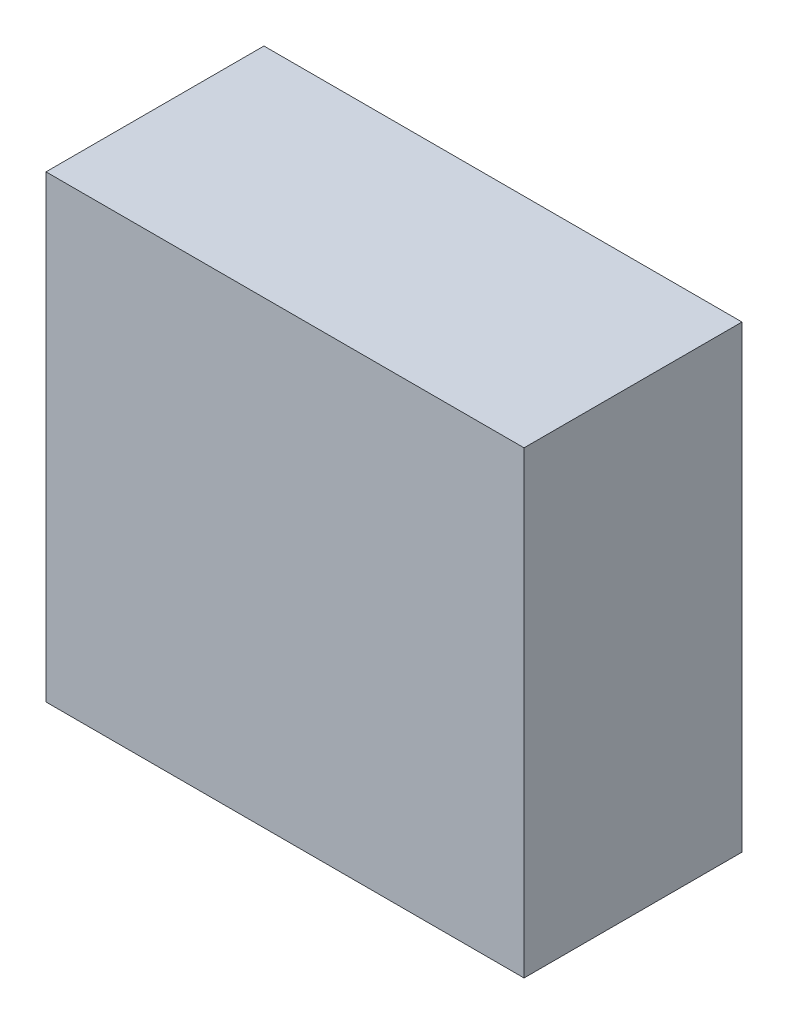
ISO-10303-21;
HEADER;
FILE_DESCRIPTION(('STEP AP214'),'2;1');
FILE_NAME('part.step','',(''),(''),'','','');
FILE_SCHEMA(('AUTOMOTIVE_DESIGN { 1 0 10303 214 1 1 1 1 }'));
ENDSEC;
DATA;
#1=APPLICATION_CONTEXT('core data for automotive mechanical design processes');
#2=APPLICATION_PROTOCOL_DEFINITION('international standard','automotive_design',2000,#1);
#3=PRODUCT_CONTEXT('',#1,'mechanical');
#4=PRODUCT('Part','Part','',(#3));
#5=PRODUCT_RELATED_PRODUCT_CATEGORY('part','',(#4));
#6=PRODUCT_DEFINITION_FORMATION('','',#4);
#7=PRODUCT_DEFINITION_CONTEXT('part definition',#1,'design');
#8=PRODUCT_DEFINITION('design','',#6,#7);
#9=PRODUCT_DEFINITION_SHAPE('','',#8);
#10=(LENGTH_UNIT() NAMED_UNIT(*) SI_UNIT(.MILLI.,.METRE.));
#11=(NAMED_UNIT(*) PLANE_ANGLE_UNIT() SI_UNIT($,.RADIAN.));
#12=(NAMED_UNIT(*) SI_UNIT($,.STERADIAN.) SOLID_ANGLE_UNIT());
#13=UNCERTAINTY_MEASURE_WITH_UNIT(LENGTH_MEASURE(1.E-05),#10,'distance_accuracy_value','');
#14=(GEOMETRIC_REPRESENTATION_CONTEXT(3) GLOBAL_UNCERTAINTY_ASSIGNED_CONTEXT((#13)) GLOBAL_UNIT_ASSIGNED_CONTEXT((#10,
#11,#12)) REPRESENTATION_CONTEXT('',''));
#15=CARTESIAN_POINT('',(0.,0.,0.));
#16=DIRECTION('',(0.,0.,1.));
#17=DIRECTION('',(1.,0.,0.));
#18=AXIS2_PLACEMENT_3D('',#15,#16,#17);
#19=CARTESIAN_POINT('',(0.,0.,0.));
#20=DIRECTION('',(0.,0.,1.));
#21=DIRECTION('',(1.,0.,0.));
#22=AXIS2_PLACEMENT_3D('',#19,#20,#21);
#23=PLANE('',#22);
#24=DIRECTION('',(0.,1.,0.));
#25=VECTOR('',#24,1.);
#26=CARTESIAN_POINT('',(16.44,14.04,0.));
#27=LINE('',#26,#25);
#28=CARTESIAN_POINT('',(16.44,17.2,0.));
#29=VERTEX_POINT('',#28);
#30=CARTESIAN_POINT('',(16.44,14.04,0.));
#31=VERTEX_POINT('',#30);
#32=EDGE_CURVE('E58',#29,#31,#27,.F.);
#33=ORIENTED_EDGE('',*,*,#32,.F.);
#34=DIRECTION('',(1.,0.,0.));
#35=VECTOR('',#34,1.);
#36=CARTESIAN_POINT('',(16.44,17.2,0.));
#37=LINE('',#36,#35);
#38=CARTESIAN_POINT('',(13.15,17.2,0.));
#39=VERTEX_POINT('',#38);
#40=EDGE_CURVE('E53',#39,#29,#37,.T.);
#41=ORIENTED_EDGE('',*,*,#40,.F.);
#42=DIRECTION('',(0.,-1.,0.));
#43=VECTOR('',#42,1.);
#44=CARTESIAN_POINT('',(13.15,17.2,0.));
#45=LINE('',#44,#43);
#46=CARTESIAN_POINT('',(13.15,14.04,0.));
#47=VERTEX_POINT('',#46);
#48=EDGE_CURVE('E68',#47,#39,#45,.F.);
#49=ORIENTED_EDGE('',*,*,#48,.F.);
#50=DIRECTION('',(1.,0.,0.));
#51=VECTOR('',#50,1.);
#52=CARTESIAN_POINT('',(13.15,14.04,0.));
#53=LINE('',#52,#51);
#54=EDGE_CURVE('E20',#31,#47,#53,.F.);
#55=ORIENTED_EDGE('',*,*,#54,.F.);
#56=EDGE_LOOP('',(#33,#41,#49,#55));
#57=FACE_BOUND('',#56,.T.);
#58=ADVANCED_FACE('F17',(#57),#23,.T.);
#59=CARTESIAN_POINT('',(13.15,14.04,-1.5));
#60=DIRECTION('',(0.,-1.,0.));
#61=DIRECTION('',(0.,0.,-1.));
#62=AXIS2_PLACEMENT_3D('',#59,#60,#61);
#63=PLANE('',#62);
#64=DIRECTION('',(1.,0.,0.));
#65=VECTOR('',#64,1.);
#66=CARTESIAN_POINT('',(0.,14.04,-1.5));
#67=LINE('',#66,#65);
#68=CARTESIAN_POINT('',(13.15,14.04,-1.5));
#69=VERTEX_POINT('',#68);
#70=CARTESIAN_POINT('',(16.44,14.04,-1.5));
#71=VERTEX_POINT('',#70);
#72=EDGE_CURVE('E74',#69,#71,#67,.T.);
#73=ORIENTED_EDGE('',*,*,#72,.T.);
#74=DIRECTION('',(0.,0.,-1.));
#75=VECTOR('',#74,1.);
#76=CARTESIAN_POINT('',(16.44,14.04,-1.5));
#77=LINE('',#76,#75);
#78=EDGE_CURVE('E63',#31,#71,#77,.T.);
#79=ORIENTED_EDGE('',*,*,#78,.F.);
#80=ORIENTED_EDGE('',*,*,#54,.T.);
#81=DIRECTION('',(0.,0.,1.));
#82=VECTOR('',#81,1.);
#83=CARTESIAN_POINT('',(13.15,14.04,-1.5));
#84=LINE('',#83,#82);
#85=EDGE_CURVE('E81',#69,#47,#84,.T.);
#86=ORIENTED_EDGE('',*,*,#85,.F.);
#87=EDGE_LOOP('',(#73,#79,#80,#86));
#88=FACE_BOUND('',#87,.T.);
#89=ADVANCED_FACE('F73',(#88),#63,.T.);
#90=CARTESIAN_POINT('',(16.44,14.04,-1.5));
#91=DIRECTION('',(1.,0.,0.));
#92=DIRECTION('',(0.,0.,-1.));
#93=AXIS2_PLACEMENT_3D('',#90,#91,#92);
#94=PLANE('',#93);
#95=DIRECTION('',(0.,1.,0.));
#96=VECTOR('',#95,1.);
#97=CARTESIAN_POINT('',(16.44,0.,-1.5));
#98=LINE('',#97,#96);
#99=CARTESIAN_POINT('',(16.44,17.2,-1.5));
#100=VERTEX_POINT('',#99);
#101=EDGE_CURVE('E84',#71,#100,#98,.T.);
#102=ORIENTED_EDGE('',*,*,#101,.T.);
#103=DIRECTION('',(0.,0.,1.));
#104=VECTOR('',#103,1.);
#105=CARTESIAN_POINT('',(16.44,17.2,-1.5));
#106=LINE('',#105,#104);
#107=EDGE_CURVE('E65',#29,#100,#106,.F.);
#108=ORIENTED_EDGE('',*,*,#107,.F.);
#109=ORIENTED_EDGE('',*,*,#32,.T.);
#110=ORIENTED_EDGE('',*,*,#78,.T.);
#111=EDGE_LOOP('',(#102,#108,#109,#110));
#112=FACE_BOUND('',#111,.T.);
#113=ADVANCED_FACE('F61',(#112),#94,.T.);
#114=CARTESIAN_POINT('',(16.44,17.2,-1.5));
#115=DIRECTION('',(0.,1.,0.));
#116=DIRECTION('',(0.,0.,1.));
#117=AXIS2_PLACEMENT_3D('',#114,#115,#116);
#118=PLANE('',#117);
#119=DIRECTION('',(1.,0.,0.));
#120=VECTOR('',#119,1.);
#121=CARTESIAN_POINT('',(0.,17.2,-1.5));
#122=LINE('',#121,#120);
#123=CARTESIAN_POINT('',(13.15,17.2,-1.5));
#124=VERTEX_POINT('',#123);
#125=EDGE_CURVE('E26',#100,#124,#122,.F.);
#126=ORIENTED_EDGE('',*,*,#125,.T.);
#127=DIRECTION('',(0.,0.,1.));
#128=VECTOR('',#127,1.);
#129=CARTESIAN_POINT('',(13.15,17.2,-1.5));
#130=LINE('',#129,#128);
#131=EDGE_CURVE('E34',#39,#124,#130,.F.);
#132=ORIENTED_EDGE('',*,*,#131,.F.);
#133=ORIENTED_EDGE('',*,*,#40,.T.);
#134=ORIENTED_EDGE('',*,*,#107,.T.);
#135=EDGE_LOOP('',(#126,#132,#133,#134));
#136=FACE_BOUND('',#135,.T.);
#137=ADVANCED_FACE('F88',(#136),#118,.T.);
#138=CARTESIAN_POINT('',(13.15,17.2,-1.5));
#139=DIRECTION('',(-1.,0.,0.));
#140=DIRECTION('',(0.,-1.,0.));
#141=AXIS2_PLACEMENT_3D('',#138,#139,#140);
#142=PLANE('',#141);
#143=DIRECTION('',(0.,1.,0.));
#144=VECTOR('',#143,1.);
#145=CARTESIAN_POINT('',(13.15,0.,-1.5));
#146=LINE('',#145,#144);
#147=EDGE_CURVE('E11',#124,#69,#146,.F.);
#148=ORIENTED_EDGE('',*,*,#147,.T.);
#149=ORIENTED_EDGE('',*,*,#85,.T.);
#150=ORIENTED_EDGE('',*,*,#48,.T.);
#151=ORIENTED_EDGE('',*,*,#131,.T.);
#152=EDGE_LOOP('',(#148,#149,#150,#151));
#153=FACE_BOUND('',#152,.T.);
#154=ADVANCED_FACE('F91',(#153),#142,.T.);
#155=CARTESIAN_POINT('',(0.,0.,-1.5));
#156=DIRECTION('',(0.,0.,1.));
#157=DIRECTION('',(1.,0.,0.));
#158=AXIS2_PLACEMENT_3D('',#155,#156,#157);
#159=PLANE('',#158);
#160=ORIENTED_EDGE('',*,*,#125,.F.);
#161=ORIENTED_EDGE('',*,*,#101,.F.);
#162=ORIENTED_EDGE('',*,*,#72,.F.);
#163=ORIENTED_EDGE('',*,*,#147,.F.);
#164=EDGE_LOOP('',(#160,#161,#162,#163));
#165=FACE_BOUND('',#164,.T.);
#166=ADVANCED_FACE('F90',(#165),#159,.F.);
#167=CLOSED_SHELL('',(#58,#89,#113,#137,#154,#166));
#168=MANIFOLD_SOLID_BREP('B1',#167);
#169=ADVANCED_BREP_SHAPE_REPRESENTATION('',(#18,#168),#14);
#170=SHAPE_DEFINITION_REPRESENTATION(#9,#169);
ENDSEC;
END-ISO-10303-21;
